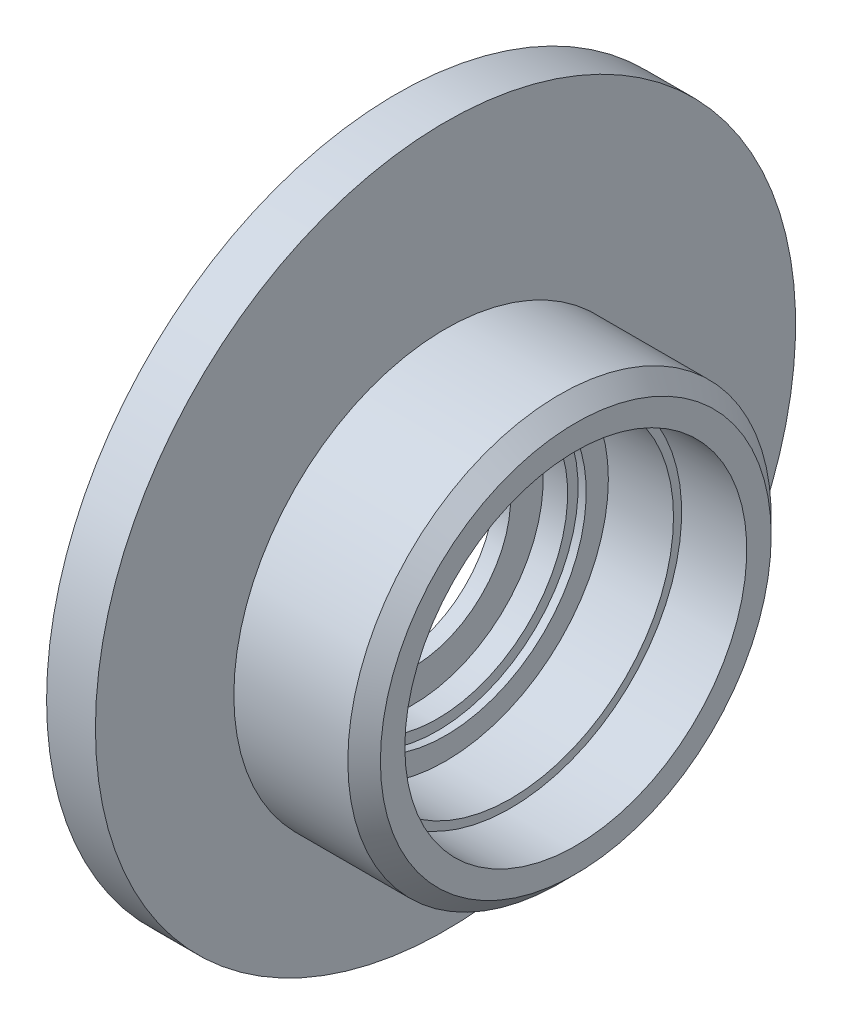
ISO-10303-21;
HEADER;
FILE_DESCRIPTION(('STEP AP214'),'2;1');
FILE_NAME('part.step','',(''),(''),'','','');
FILE_SCHEMA(('AUTOMOTIVE_DESIGN { 1 0 10303 214 1 1 1 1 }'));
ENDSEC;
DATA;
#1=APPLICATION_CONTEXT('core data for automotive mechanical design processes');
#2=APPLICATION_PROTOCOL_DEFINITION('international standard','automotive_design',2000,#1);
#3=PRODUCT_CONTEXT('',#1,'mechanical');
#4=PRODUCT('Part','Part','',(#3));
#5=PRODUCT_RELATED_PRODUCT_CATEGORY('part','',(#4));
#6=PRODUCT_DEFINITION_FORMATION('','',#4);
#7=PRODUCT_DEFINITION_CONTEXT('part definition',#1,'design');
#8=PRODUCT_DEFINITION('design','',#6,#7);
#9=PRODUCT_DEFINITION_SHAPE('','',#8);
#10=(LENGTH_UNIT() NAMED_UNIT(*) SI_UNIT(.MILLI.,.METRE.));
#11=(NAMED_UNIT(*) PLANE_ANGLE_UNIT() SI_UNIT($,.RADIAN.));
#12=(NAMED_UNIT(*) SI_UNIT($,.STERADIAN.) SOLID_ANGLE_UNIT());
#13=UNCERTAINTY_MEASURE_WITH_UNIT(LENGTH_MEASURE(1.E-05),#10,'distance_accuracy_value','');
#14=(GEOMETRIC_REPRESENTATION_CONTEXT(3) GLOBAL_UNCERTAINTY_ASSIGNED_CONTEXT((#13)) GLOBAL_UNIT_ASSIGNED_CONTEXT((#10,
#11,#12)) REPRESENTATION_CONTEXT('',''));
#15=CARTESIAN_POINT('',(0.,0.,0.));
#16=DIRECTION('',(0.,0.,1.));
#17=DIRECTION('',(1.,0.,0.));
#18=AXIS2_PLACEMENT_3D('',#15,#16,#17);
#19=CARTESIAN_POINT('',(-4.16900036795222,0.,0.));
#20=DIRECTION('',(-1.,0.,0.));
#21=DIRECTION('',(0.,0.,1.));
#22=AXIS2_PLACEMENT_3D('',#19,#20,#21);
#23=CYLINDRICAL_SURFACE('',#22,26.);
#24=CARTESIAN_POINT('',(20.,0.,0.));
#25=DIRECTION('',(-1.,0.,0.));
#26=DIRECTION('',(0.,0.,1.));
#27=AXIS2_PLACEMENT_3D('',#24,#25,#26);
#28=CIRCLE('',#27,26.);
#29=CARTESIAN_POINT('',(20.,0.,26.));
#30=VERTEX_POINT('',#29);
#31=EDGE_CURVE('E384',#30,#30,#28,.T.);
#32=ORIENTED_EDGE('',*,*,#31,.T.);
#33=EDGE_LOOP('',(#32));
#34=FACE_BOUND('',#33,.T.);
#35=CARTESIAN_POINT('',(6.,0.,0.));
#36=DIRECTION('',(-1.,0.,0.));
#37=DIRECTION('',(0.,0.,1.));
#38=AXIS2_PLACEMENT_3D('',#35,#36,#37);
#39=CIRCLE('',#38,26.);
#40=CARTESIAN_POINT('',(6.,0.,26.));
#41=VERTEX_POINT('',#40);
#42=EDGE_CURVE('E10',#41,#41,#39,.T.);
#43=ORIENTED_EDGE('',*,*,#42,.F.);
#44=EDGE_LOOP('',(#43));
#45=FACE_BOUND('',#44,.T.);
#46=ADVANCED_FACE('F346',(#34,#45),#23,.T.);
#47=CARTESIAN_POINT('',(-4.16900036795222,0.,0.));
#48=DIRECTION('',(-1.,0.,0.));
#49=DIRECTION('',(0.,0.,1.));
#50=AXIS2_PLACEMENT_3D('',#47,#48,#49);
#51=CYLINDRICAL_SURFACE('',#50,20.);
#52=CARTESIAN_POINT('',(14.,0.,0.));
#53=DIRECTION('',(-1.,0.,0.));
#54=DIRECTION('',(0.,0.,1.));
#55=AXIS2_PLACEMENT_3D('',#52,#53,#54);
#56=CIRCLE('',#55,20.);
#57=CARTESIAN_POINT('',(14.,0.,20.));
#58=VERTEX_POINT('',#57);
#59=EDGE_CURVE('E372',#58,#58,#56,.T.);
#60=ORIENTED_EDGE('',*,*,#59,.F.);
#61=EDGE_LOOP('',(#60));
#62=FACE_BOUND('',#61,.T.);
#63=CARTESIAN_POINT('',(6.,0.,0.));
#64=DIRECTION('',(-1.,0.,0.));
#65=DIRECTION('',(0.,0.,1.));
#66=AXIS2_PLACEMENT_3D('',#63,#64,#65);
#67=CIRCLE('',#66,20.);
#68=CARTESIAN_POINT('',(6.,0.,20.));
#69=VERTEX_POINT('',#68);
#70=EDGE_CURVE('E350',#69,#69,#67,.F.);
#71=ORIENTED_EDGE('',*,*,#70,.F.);
#72=EDGE_LOOP('',(#71));
#73=FACE_BOUND('',#72,.T.);
#74=ADVANCED_FACE('F412',(#62,#73),#51,.F.);
#75=CARTESIAN_POINT('',(22.,0.,0.));
#76=DIRECTION('',(-1.,0.,0.));
#77=DIRECTION('',(0.,0.,1.));
#78=AXIS2_PLACEMENT_3D('',#75,#76,#77);
#79=CONICAL_SURFACE('',#78,24.,0.785398163397447);
#80=ORIENTED_EDGE('',*,*,#31,.F.);
#81=EDGE_LOOP('',(#80));
#82=FACE_BOUND('',#81,.T.);
#83=CARTESIAN_POINT('',(22.,0.,0.));
#84=DIRECTION('',(-1.,0.,0.));
#85=DIRECTION('',(0.,0.,1.));
#86=AXIS2_PLACEMENT_3D('',#83,#84,#85);
#87=CIRCLE('',#86,24.);
#88=CARTESIAN_POINT('',(22.,0.,24.));
#89=VERTEX_POINT('',#88);
#90=EDGE_CURVE('E381',#89,#89,#87,.T.);
#91=ORIENTED_EDGE('',*,*,#90,.T.);
#92=EDGE_LOOP('',(#91));
#93=FACE_BOUND('',#92,.T.);
#94=ADVANCED_FACE('F419',(#82,#93),#79,.T.);
#95=CARTESIAN_POINT('',(22.,24.,0.));
#96=DIRECTION('',(-1.,0.,0.));
#97=DIRECTION('',(0.,0.,1.));
#98=AXIS2_PLACEMENT_3D('',#95,#96,#97);
#99=PLANE('',#98);
#100=ORIENTED_EDGE('',*,*,#90,.F.);
#101=EDGE_LOOP('',(#100));
#102=FACE_BOUND('',#101,.T.);
#103=CARTESIAN_POINT('',(22.,0.,0.));
#104=DIRECTION('',(-1.,0.,0.));
#105=DIRECTION('',(0.,0.,1.));
#106=AXIS2_PLACEMENT_3D('',#103,#104,#105);
#107=CIRCLE('',#106,21.);
#108=CARTESIAN_POINT('',(22.,0.,21.));
#109=VERTEX_POINT('',#108);
#110=EDGE_CURVE('E378',#109,#109,#107,.T.);
#111=ORIENTED_EDGE('',*,*,#110,.T.);
#112=EDGE_LOOP('',(#111));
#113=FACE_BOUND('',#112,.T.);
#114=ADVANCED_FACE('F476',(#102,#113),#99,.F.);
#115=CARTESIAN_POINT('',(-4.16900036795222,0.,0.));
#116=DIRECTION('',(-1.,0.,0.));
#117=DIRECTION('',(0.,0.,1.));
#118=AXIS2_PLACEMENT_3D('',#115,#116,#117);
#119=CYLINDRICAL_SURFACE('',#118,21.);
#120=ORIENTED_EDGE('',*,*,#110,.F.);
#121=EDGE_LOOP('',(#120));
#122=FACE_BOUND('',#121,.T.);
#123=CARTESIAN_POINT('',(14.,0.,0.));
#124=DIRECTION('',(-1.,0.,0.));
#125=DIRECTION('',(0.,0.,1.));
#126=AXIS2_PLACEMENT_3D('',#123,#124,#125);
#127=CIRCLE('',#126,21.);
#128=CARTESIAN_POINT('',(14.,0.,21.));
#129=VERTEX_POINT('',#128);
#130=EDGE_CURVE('E375',#129,#129,#127,.T.);
#131=ORIENTED_EDGE('',*,*,#130,.T.);
#132=EDGE_LOOP('',(#131));
#133=FACE_BOUND('',#132,.T.);
#134=ADVANCED_FACE('F454',(#122,#133),#119,.F.);
#135=CARTESIAN_POINT('',(14.,21.,0.));
#136=DIRECTION('',(-1.,0.,0.));
#137=DIRECTION('',(0.,0.,1.));
#138=AXIS2_PLACEMENT_3D('',#135,#136,#137);
#139=PLANE('',#138);
#140=ORIENTED_EDGE('',*,*,#130,.F.);
#141=EDGE_LOOP('',(#140));
#142=FACE_BOUND('',#141,.T.);
#143=ORIENTED_EDGE('',*,*,#59,.T.);
#144=EDGE_LOOP('',(#143));
#145=FACE_BOUND('',#144,.T.);
#146=ADVANCED_FACE('F448',(#142,#145),#139,.F.);
#147=CARTESIAN_POINT('',(6.,0.,0.));
#148=DIRECTION('',(-1.,0.,0.));
#149=DIRECTION('',(0.,0.,1.));
#150=AXIS2_PLACEMENT_3D('',#147,#148,#149);
#151=CYLINDRICAL_SURFACE('',#150,17.284931715374);
#152=CARTESIAN_POINT('',(6.,0.,0.));
#153=DIRECTION('',(-1.,0.,0.));
#154=DIRECTION('',(0.,0.,1.));
#155=AXIS2_PLACEMENT_3D('',#152,#153,#154);
#156=CIRCLE('',#155,17.284931715374);
#157=CARTESIAN_POINT('',(6.,0.,17.284931715374));
#158=VERTEX_POINT('',#157);
#159=EDGE_CURVE('E440',#158,#158,#156,.T.);
#160=ORIENTED_EDGE('',*,*,#159,.F.);
#161=EDGE_LOOP('',(#160));
#162=FACE_BOUND('',#161,.T.);
#163=CARTESIAN_POINT('',(5.,0.,0.));
#164=DIRECTION('',(-1.,0.,0.));
#165=DIRECTION('',(0.,0.,1.));
#166=AXIS2_PLACEMENT_3D('',#163,#164,#165);
#167=CIRCLE('',#166,17.284931715374);
#168=CARTESIAN_POINT('',(5.,0.,17.284931715374));
#169=VERTEX_POINT('',#168);
#170=EDGE_CURVE('E358',#169,#169,#167,.T.);
#171=ORIENTED_EDGE('',*,*,#170,.T.);
#172=EDGE_LOOP('',(#171));
#173=FACE_BOUND('',#172,.T.);
#174=ADVANCED_FACE('F392',(#162,#173),#151,.F.);
#175=CARTESIAN_POINT('',(6.,5.,0.));
#176=DIRECTION('',(-1.,0.,0.));
#177=DIRECTION('',(0.,0.,1.));
#178=AXIS2_PLACEMENT_3D('',#175,#176,#177);
#179=PLANE('',#178);
#180=ORIENTED_EDGE('',*,*,#159,.T.);
#181=EDGE_LOOP('',(#180));
#182=FACE_BOUND('',#181,.T.);
#183=ORIENTED_EDGE('',*,*,#70,.T.);
#184=EDGE_LOOP('',(#183));
#185=FACE_BOUND('',#184,.T.);
#186=ADVANCED_FACE('F432',(#182,#185),#179,.F.);
#187=CARTESIAN_POINT('',(2.,16.,0.));
#188=DIRECTION('',(-1.,0.,0.));
#189=DIRECTION('',(0.,0.,1.));
#190=AXIS2_PLACEMENT_3D('',#187,#188,#189);
#191=PLANE('',#190);
#192=CARTESIAN_POINT('',(2.,0.,0.));
#193=DIRECTION('',(-1.,0.,0.));
#194=DIRECTION('',(0.,0.,1.));
#195=AXIS2_PLACEMENT_3D('',#192,#193,#194);
#196=CIRCLE('',#195,16.);
#197=CARTESIAN_POINT('',(2.,0.,16.));
#198=VERTEX_POINT('',#197);
#199=EDGE_CURVE('E366',#198,#198,#196,.T.);
#200=ORIENTED_EDGE('',*,*,#199,.F.);
#201=EDGE_LOOP('',(#200));
#202=FACE_BOUND('',#201,.T.);
#203=CARTESIAN_POINT('',(2.,0.,0.));
#204=DIRECTION('',(-1.,0.,0.));
#205=DIRECTION('',(0.,0.,1.));
#206=AXIS2_PLACEMENT_3D('',#203,#204,#205);
#207=CIRCLE('',#206,12.);
#208=CARTESIAN_POINT('',(2.,0.,12.));
#209=VERTEX_POINT('',#208);
#210=EDGE_CURVE('E363',#209,#209,#207,.T.);
#211=ORIENTED_EDGE('',*,*,#210,.T.);
#212=EDGE_LOOP('',(#211));
#213=FACE_BOUND('',#212,.T.);
#214=ADVANCED_FACE('F407',(#202,#213),#191,.F.);
#215=CARTESIAN_POINT('',(-4.16900036795222,0.,0.));
#216=DIRECTION('',(-1.,0.,0.));
#217=DIRECTION('',(0.,0.,1.));
#218=AXIS2_PLACEMENT_3D('',#215,#216,#217);
#219=CYLINDRICAL_SURFACE('',#218,16.);
#220=CARTESIAN_POINT('',(5.,0.,0.));
#221=DIRECTION('',(-1.,0.,0.));
#222=DIRECTION('',(0.,0.,1.));
#223=AXIS2_PLACEMENT_3D('',#220,#221,#222);
#224=CIRCLE('',#223,16.);
#225=CARTESIAN_POINT('',(5.,0.,16.));
#226=VERTEX_POINT('',#225);
#227=EDGE_CURVE('E369',#226,#226,#224,.T.);
#228=ORIENTED_EDGE('',*,*,#227,.F.);
#229=EDGE_LOOP('',(#228));
#230=FACE_BOUND('',#229,.T.);
#231=ORIENTED_EDGE('',*,*,#199,.T.);
#232=EDGE_LOOP('',(#231));
#233=FACE_BOUND('',#232,.T.);
#234=ADVANCED_FACE('F396',(#230,#233),#219,.F.);
#235=CARTESIAN_POINT('',(5.,20.,0.));
#236=DIRECTION('',(-1.,0.,0.));
#237=DIRECTION('',(0.,0.,1.));
#238=AXIS2_PLACEMENT_3D('',#235,#236,#237);
#239=PLANE('',#238);
#240=ORIENTED_EDGE('',*,*,#227,.T.);
#241=EDGE_LOOP('',(#240));
#242=FACE_BOUND('',#241,.T.);
#243=ORIENTED_EDGE('',*,*,#170,.F.);
#244=EDGE_LOOP('',(#243));
#245=FACE_BOUND('',#244,.T.);
#246=ADVANCED_FACE('F394',(#242,#245),#239,.F.);
#247=CARTESIAN_POINT('',(-4.16900036795222,0.,0.));
#248=DIRECTION('',(-1.,0.,0.));
#249=DIRECTION('',(0.,0.,1.));
#250=AXIS2_PLACEMENT_3D('',#247,#248,#249);
#251=CYLINDRICAL_SURFACE('',#250,12.);
#252=ORIENTED_EDGE('',*,*,#210,.F.);
#253=EDGE_LOOP('',(#252));
#254=FACE_BOUND('',#253,.T.);
#255=CARTESIAN_POINT('',(0.,0.,0.));
#256=DIRECTION('',(-1.,0.,0.));
#257=DIRECTION('',(0.,0.,1.));
#258=AXIS2_PLACEMENT_3D('',#255,#256,#257);
#259=CIRCLE('',#258,12.);
#260=CARTESIAN_POINT('',(0.,0.,12.));
#261=VERTEX_POINT('',#260);
#262=EDGE_CURVE('E387',#261,#261,#259,.T.);
#263=ORIENTED_EDGE('',*,*,#262,.T.);
#264=EDGE_LOOP('',(#263));
#265=FACE_BOUND('',#264,.T.);
#266=ADVANCED_FACE('F348',(#254,#265),#251,.F.);
#267=CARTESIAN_POINT('',(0.,12.,0.));
#268=DIRECTION('',(1.,0.,0.));
#269=DIRECTION('',(0.,0.,-1.));
#270=AXIS2_PLACEMENT_3D('',#267,#268,#269);
#271=PLANE('',#270);
#272=CARTESIAN_POINT('',(0.,5.,0.));
#273=DIRECTION('',(-1.,0.,0.));
#274=DIRECTION('',(0.,0.,1.));
#275=AXIS2_PLACEMENT_3D('',#272,#273,#274);
#276=CIRCLE('',#275,43.);
#277=CARTESIAN_POINT('',(0.,5.,43.));
#278=VERTEX_POINT('',#277);
#279=EDGE_CURVE('E436',#278,#278,#276,.T.);
#280=ORIENTED_EDGE('',*,*,#279,.T.);
#281=EDGE_LOOP('',(#280));
#282=FACE_BOUND('',#281,.T.);
#283=ORIENTED_EDGE('',*,*,#262,.F.);
#284=EDGE_LOOP('',(#283));
#285=FACE_BOUND('',#284,.T.);
#286=ADVANCED_FACE('F404',(#282,#285),#271,.F.);
#287=CARTESIAN_POINT('',(6.,5.,0.));
#288=DIRECTION('',(-1.,0.,0.));
#289=DIRECTION('',(0.,0.,1.));
#290=AXIS2_PLACEMENT_3D('',#287,#288,#289);
#291=CIRCLE('',#290,43.);
#292=CARTESIAN_POINT('',(6.,5.,43.));
#293=VERTEX_POINT('',#292);
#294=EDGE_CURVE('E361',#293,#293,#291,.T.);
#295=ORIENTED_EDGE('',*,*,#294,.F.);
#296=EDGE_LOOP('',(#295));
#297=FACE_BOUND('',#296,.T.);
#298=ORIENTED_EDGE('',*,*,#42,.T.);
#299=EDGE_LOOP('',(#298));
#300=FACE_BOUND('',#299,.T.);
#301=ADVANCED_FACE('F425',(#297,#300),#179,.F.);
#302=CARTESIAN_POINT('',(6.,5.,0.));
#303=DIRECTION('',(-1.,0.,0.));
#304=DIRECTION('',(0.,0.,1.));
#305=AXIS2_PLACEMENT_3D('',#302,#303,#304);
#306=CYLINDRICAL_SURFACE('',#305,43.);
#307=ORIENTED_EDGE('',*,*,#294,.T.);
#308=EDGE_LOOP('',(#307));
#309=FACE_BOUND('',#308,.T.);
#310=ORIENTED_EDGE('',*,*,#279,.F.);
#311=EDGE_LOOP('',(#310));
#312=FACE_BOUND('',#311,.T.);
#313=ADVANCED_FACE('F429',(#309,#312),#306,.T.);
#314=CLOSED_SHELL('',(#46,#74,#94,#114,#134,#146,#174,#186,#214,#234,#246,#266,#286,#301,#313));
#315=MANIFOLD_SOLID_BREP('B2',#314);
#316=ADVANCED_BREP_SHAPE_REPRESENTATION('',(#18,#315),#14);
#317=SHAPE_DEFINITION_REPRESENTATION(#9,#316);
ENDSEC;
END-ISO-10303-21;
